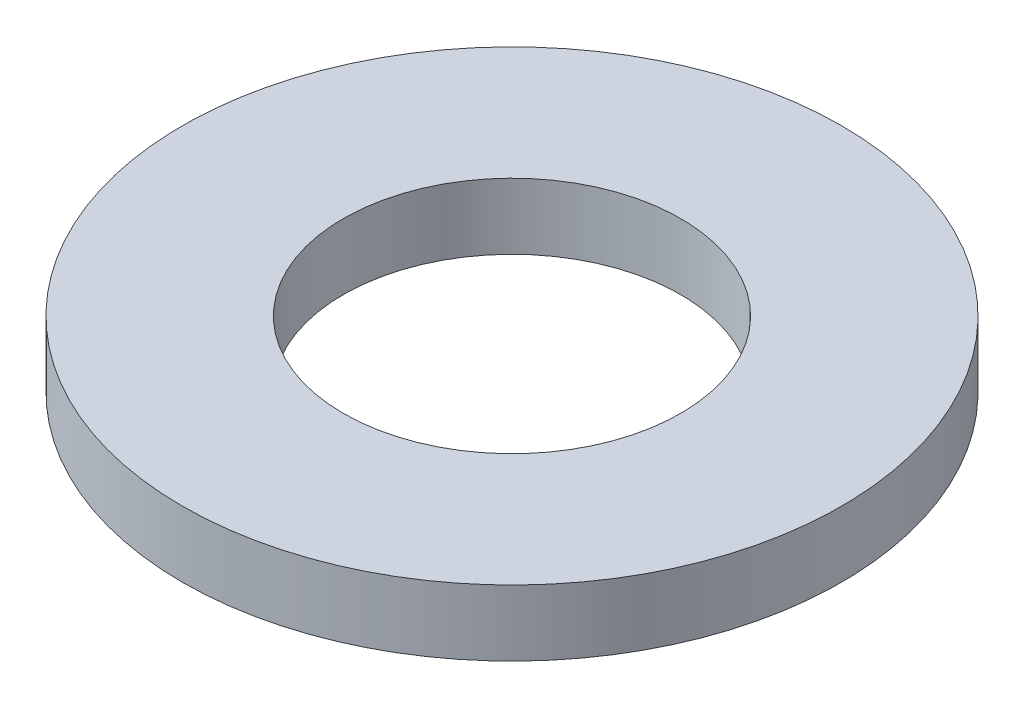
ISO-10303-21;
HEADER;
FILE_DESCRIPTION(('STEP AP214'),'2;1');
FILE_NAME('part.step','',(''),(''),'','','');
FILE_SCHEMA(('AUTOMOTIVE_DESIGN { 1 0 10303 214 1 1 1 1 }'));
ENDSEC;
DATA;
#1=APPLICATION_CONTEXT('core data for automotive mechanical design processes');
#2=APPLICATION_PROTOCOL_DEFINITION('international standard','automotive_design',2000,#1);
#3=PRODUCT_CONTEXT('',#1,'mechanical');
#4=PRODUCT('Part','Part','',(#3));
#5=PRODUCT_RELATED_PRODUCT_CATEGORY('part','',(#4));
#6=PRODUCT_DEFINITION_FORMATION('','',#4);
#7=PRODUCT_DEFINITION_CONTEXT('part definition',#1,'design');
#8=PRODUCT_DEFINITION('design','',#6,#7);
#9=PRODUCT_DEFINITION_SHAPE('','',#8);
#10=(LENGTH_UNIT() NAMED_UNIT(*) SI_UNIT(.MILLI.,.METRE.));
#11=(NAMED_UNIT(*) PLANE_ANGLE_UNIT() SI_UNIT($,.RADIAN.));
#12=(NAMED_UNIT(*) SI_UNIT($,.STERADIAN.) SOLID_ANGLE_UNIT());
#13=UNCERTAINTY_MEASURE_WITH_UNIT(LENGTH_MEASURE(1.E-05),#10,'distance_accuracy_value','');
#14=(GEOMETRIC_REPRESENTATION_CONTEXT(3) GLOBAL_UNCERTAINTY_ASSIGNED_CONTEXT((#13)) GLOBAL_UNIT_ASSIGNED_CONTEXT((#10,
#11,#12)) REPRESENTATION_CONTEXT('',''));
#15=CARTESIAN_POINT('',(0.,0.,0.));
#16=DIRECTION('',(0.,0.,1.));
#17=DIRECTION('',(1.,0.,0.));
#18=AXIS2_PLACEMENT_3D('',#15,#16,#17);
#19=CARTESIAN_POINT('',(0.,1.27,0.));
#20=DIRECTION('',(0.,1.,0.));
#21=DIRECTION('',(0.,0.,1.));
#22=AXIS2_PLACEMENT_3D('',#19,#20,#21);
#23=PLANE('',#22);
#24=CARTESIAN_POINT('',(0.,1.27,0.));
#25=DIRECTION('',(0.,1.,0.));
#26=DIRECTION('',(0.,0.,1.));
#27=AXIS2_PLACEMENT_3D('',#24,#25,#26);
#28=CIRCLE('',#27,6.35);
#29=CARTESIAN_POINT('',(0.,1.27,6.35));
#30=VERTEX_POINT('',#29);
#31=EDGE_CURVE('E10',#30,#30,#28,.T.);
#32=ORIENTED_EDGE('',*,*,#31,.T.);
#33=EDGE_LOOP('',(#32));
#34=FACE_BOUND('',#33,.T.);
#35=CARTESIAN_POINT('',(0.,1.27,0.));
#36=DIRECTION('',(0.,1.,0.));
#37=DIRECTION('',(0.,0.,1.));
#38=AXIS2_PLACEMENT_3D('',#35,#36,#37);
#39=CIRCLE('',#38,3.2512);
#40=CARTESIAN_POINT('',(0.,1.27,3.2512));
#41=VERTEX_POINT('',#40);
#42=EDGE_CURVE('E42',#41,#41,#39,.T.);
#43=ORIENTED_EDGE('',*,*,#42,.F.);
#44=EDGE_LOOP('',(#43));
#45=FACE_BOUND('',#44,.T.);
#46=ADVANCED_FACE('F31',(#34,#45),#23,.T.);
#47=CARTESIAN_POINT('',(0.,0.,0.));
#48=DIRECTION('',(0.,1.,0.));
#49=DIRECTION('',(0.,0.,1.));
#50=AXIS2_PLACEMENT_3D('',#47,#48,#49);
#51=PLANE('',#50);
#52=CARTESIAN_POINT('',(0.,0.,0.));
#53=DIRECTION('',(0.,1.,0.));
#54=DIRECTION('',(0.,0.,1.));
#55=AXIS2_PLACEMENT_3D('',#52,#53,#54);
#56=CIRCLE('',#55,6.35);
#57=CARTESIAN_POINT('',(0.,0.,6.35));
#58=VERTEX_POINT('',#57);
#59=EDGE_CURVE('E35',#58,#58,#56,.T.);
#60=ORIENTED_EDGE('',*,*,#59,.F.);
#61=EDGE_LOOP('',(#60));
#62=FACE_BOUND('',#61,.T.);
#63=CARTESIAN_POINT('',(0.,0.,0.));
#64=DIRECTION('',(0.,1.,0.));
#65=DIRECTION('',(0.,0.,1.));
#66=AXIS2_PLACEMENT_3D('',#63,#64,#65);
#67=CIRCLE('',#66,3.2512);
#68=CARTESIAN_POINT('',(0.,0.,3.2512));
#69=VERTEX_POINT('',#68);
#70=EDGE_CURVE('E44',#69,#69,#67,.T.);
#71=ORIENTED_EDGE('',*,*,#70,.T.);
#72=EDGE_LOOP('',(#71));
#73=FACE_BOUND('',#72,.T.);
#74=ADVANCED_FACE('F54',(#62,#73),#51,.F.);
#75=CARTESIAN_POINT('',(0.,1.27,0.));
#76=DIRECTION('',(0.,-1.,0.));
#77=DIRECTION('',(0.,0.,-1.));
#78=AXIS2_PLACEMENT_3D('',#75,#76,#77);
#79=CYLINDRICAL_SURFACE('',#78,6.35);
#80=ORIENTED_EDGE('',*,*,#31,.F.);
#81=EDGE_LOOP('',(#80));
#82=FACE_BOUND('',#81,.T.);
#83=ORIENTED_EDGE('',*,*,#59,.T.);
#84=EDGE_LOOP('',(#83));
#85=FACE_BOUND('',#84,.T.);
#86=ADVANCED_FACE('F33',(#82,#85),#79,.T.);
#87=CARTESIAN_POINT('',(0.,1.27,0.));
#88=DIRECTION('',(0.,-1.,0.));
#89=DIRECTION('',(0.,0.,-1.));
#90=AXIS2_PLACEMENT_3D('',#87,#88,#89);
#91=CYLINDRICAL_SURFACE('',#90,3.2512);
#92=ORIENTED_EDGE('',*,*,#42,.T.);
#93=EDGE_LOOP('',(#92));
#94=FACE_BOUND('',#93,.T.);
#95=ORIENTED_EDGE('',*,*,#70,.F.);
#96=EDGE_LOOP('',(#95));
#97=FACE_BOUND('',#96,.T.);
#98=ADVANCED_FACE('F50',(#94,#97),#91,.F.);
#99=CLOSED_SHELL('',(#46,#74,#86,#98));
#100=MANIFOLD_SOLID_BREP('B2',#99);
#101=ADVANCED_BREP_SHAPE_REPRESENTATION('',(#18,#100),#14);
#102=SHAPE_DEFINITION_REPRESENTATION(#9,#101);
ENDSEC;
END-ISO-10303-21;
